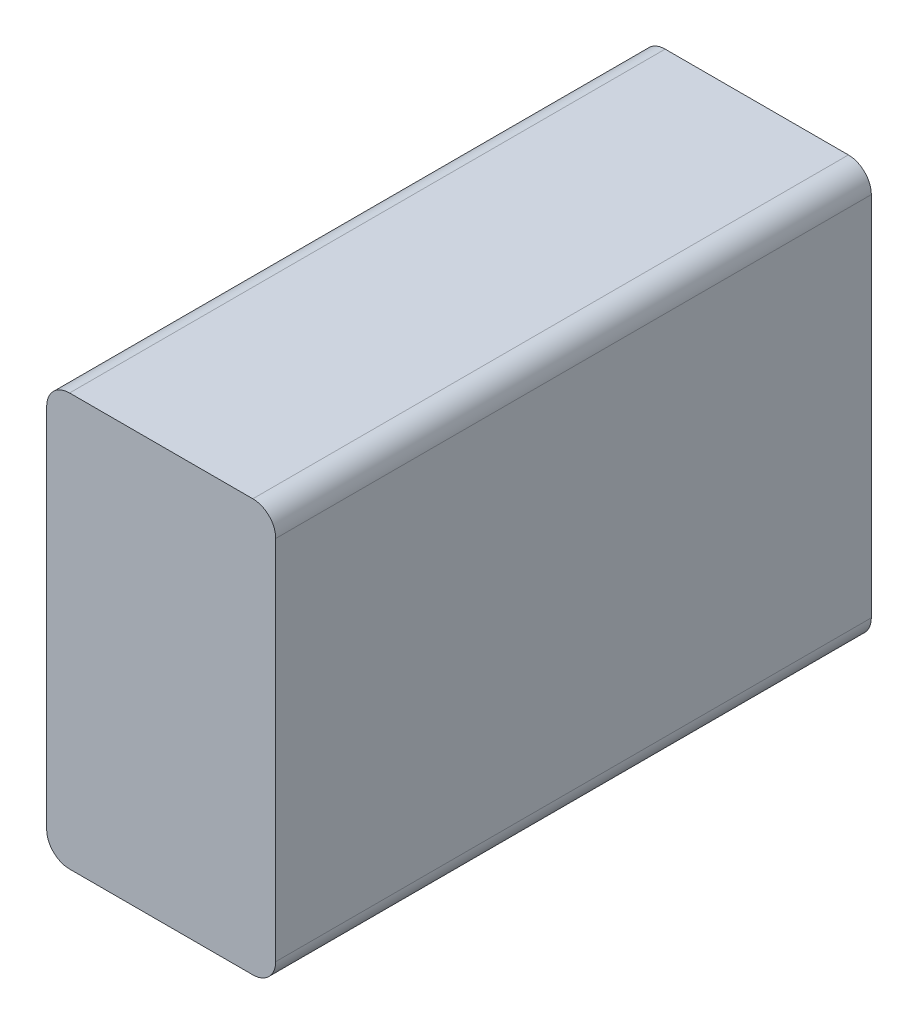
ISO-10303-21;
HEADER;
FILE_DESCRIPTION(('STEP AP214'),'2;1');
FILE_NAME('part.step','',(''),(''),'','','');
FILE_SCHEMA(('AUTOMOTIVE_DESIGN { 1 0 10303 214 1 1 1 1 }'));
ENDSEC;
DATA;
#1=APPLICATION_CONTEXT('core data for automotive mechanical design processes');
#2=APPLICATION_PROTOCOL_DEFINITION('international standard','automotive_design',2000,#1);
#3=PRODUCT_CONTEXT('',#1,'mechanical');
#4=PRODUCT('Part','Part','',(#3));
#5=PRODUCT_RELATED_PRODUCT_CATEGORY('part','',(#4));
#6=PRODUCT_DEFINITION_FORMATION('','',#4);
#7=PRODUCT_DEFINITION_CONTEXT('part definition',#1,'design');
#8=PRODUCT_DEFINITION('design','',#6,#7);
#9=PRODUCT_DEFINITION_SHAPE('','',#8);
#10=(LENGTH_UNIT() NAMED_UNIT(*) SI_UNIT(.MILLI.,.METRE.));
#11=(NAMED_UNIT(*) PLANE_ANGLE_UNIT() SI_UNIT($,.RADIAN.));
#12=(NAMED_UNIT(*) SI_UNIT($,.STERADIAN.) SOLID_ANGLE_UNIT());
#13=UNCERTAINTY_MEASURE_WITH_UNIT(LENGTH_MEASURE(1.E-05),#10,'distance_accuracy_value','');
#14=(GEOMETRIC_REPRESENTATION_CONTEXT(3) GLOBAL_UNCERTAINTY_ASSIGNED_CONTEXT((#13)) GLOBAL_UNIT_ASSIGNED_CONTEXT((#10,
#11,#12)) REPRESENTATION_CONTEXT('',''));
#15=CARTESIAN_POINT('',(0.,0.,0.));
#16=DIRECTION('',(0.,0.,1.));
#17=DIRECTION('',(1.,0.,0.));
#18=AXIS2_PLACEMENT_3D('',#15,#16,#17);
#19=CARTESIAN_POINT('',(-61.1526989816066,9.9853372072383,26.));
#20=DIRECTION('',(0.,0.,-1.));
#21=DIRECTION('',(-1.,0.,0.));
#22=AXIS2_PLACEMENT_3D('',#19,#20,#21);
#23=CYLINDRICAL_SURFACE('',#22,1.);
#24=CARTESIAN_POINT('',(-61.1526989816066,9.9853372072383,0.));
#25=DIRECTION('',(0.,0.,1.));
#26=DIRECTION('',(-1.,0.,0.));
#27=AXIS2_PLACEMENT_3D('',#24,#25,#26);
#28=CIRCLE('',#27,1.);
#29=CARTESIAN_POINT('',(-61.1526989816066,10.9853372072383,0.));
#30=VERTEX_POINT('',#29);
#31=CARTESIAN_POINT('',(-62.1526989816066,9.98533720723832,0.));
#32=VERTEX_POINT('',#31);
#33=EDGE_CURVE('E140',#30,#32,#28,.T.);
#34=ORIENTED_EDGE('',*,*,#33,.T.);
#35=DIRECTION('',(0.,0.,-1.));
#36=VECTOR('',#35,1.);
#37=CARTESIAN_POINT('',(-62.1526989816066,9.98533720723832,26.));
#38=LINE('',#37,#36);
#39=CARTESIAN_POINT('',(-62.1526989816066,9.98533720723832,26.));
#40=VERTEX_POINT('',#39);
#41=EDGE_CURVE('E11',#40,#32,#38,.T.);
#42=ORIENTED_EDGE('',*,*,#41,.F.);
#43=CARTESIAN_POINT('',(-61.1526989816066,9.9853372072383,26.));
#44=DIRECTION('',(0.,0.,1.));
#45=DIRECTION('',(-1.,0.,0.));
#46=AXIS2_PLACEMENT_3D('',#43,#44,#45);
#47=CIRCLE('',#46,1.);
#48=CARTESIAN_POINT('',(-61.1526989816066,10.9853372072383,26.));
#49=VERTEX_POINT('',#48);
#50=EDGE_CURVE('E162',#49,#40,#47,.T.);
#51=ORIENTED_EDGE('',*,*,#50,.F.);
#52=DIRECTION('',(0.,0.,-1.));
#53=VECTOR('',#52,1.);
#54=CARTESIAN_POINT('',(-61.1526989816066,10.9853372072383,26.));
#55=LINE('',#54,#53);
#56=EDGE_CURVE('E136',#49,#30,#55,.T.);
#57=ORIENTED_EDGE('',*,*,#56,.T.);
#58=EDGE_LOOP('',(#34,#42,#51,#57));
#59=FACE_BOUND('',#58,.T.);
#60=ADVANCED_FACE('F39',(#59),#23,.T.);
#61=CARTESIAN_POINT('',(-62.1526989816066,9.98533720723832,26.));
#62=DIRECTION('',(1.,0.,0.));
#63=DIRECTION('',(0.,1.,0.));
#64=AXIS2_PLACEMENT_3D('',#61,#62,#63);
#65=PLANE('',#64);
#66=DIRECTION('',(0.,-1.,0.));
#67=VECTOR('',#66,1.);
#68=CARTESIAN_POINT('',(-62.1526989816066,9.98533720723832,0.));
#69=LINE('',#68,#67);
#70=CARTESIAN_POINT('',(-62.1526989816066,-6.0146627927617,0.));
#71=VERTEX_POINT('',#70);
#72=EDGE_CURVE('E144',#32,#71,#69,.T.);
#73=ORIENTED_EDGE('',*,*,#72,.T.);
#74=DIRECTION('',(0.,0.,-1.));
#75=VECTOR('',#74,1.);
#76=CARTESIAN_POINT('',(-62.1526989816066,-6.0146627927617,26.));
#77=LINE('',#76,#75);
#78=CARTESIAN_POINT('',(-62.1526989816066,-6.0146627927617,26.));
#79=VERTEX_POINT('',#78);
#80=EDGE_CURVE('E48',#79,#71,#77,.T.);
#81=ORIENTED_EDGE('',*,*,#80,.F.);
#82=DIRECTION('',(0.,-1.,0.));
#83=VECTOR('',#82,1.);
#84=CARTESIAN_POINT('',(-62.1526989816066,9.98533720723832,26.));
#85=LINE('',#84,#83);
#86=EDGE_CURVE('E99',#40,#79,#85,.T.);
#87=ORIENTED_EDGE('',*,*,#86,.F.);
#88=ORIENTED_EDGE('',*,*,#41,.T.);
#89=EDGE_LOOP('',(#73,#81,#87,#88));
#90=FACE_BOUND('',#89,.T.);
#91=ADVANCED_FACE('F208',(#90),#65,.F.);
#92=CARTESIAN_POINT('',(-61.1526989816066,-6.01466279276169,26.));
#93=DIRECTION('',(0.,0.,-1.));
#94=DIRECTION('',(-1.,0.,0.));
#95=AXIS2_PLACEMENT_3D('',#92,#93,#94);
#96=CYLINDRICAL_SURFACE('',#95,0.999999999999999);
#97=CARTESIAN_POINT('',(-61.1526989816066,-6.01466279276169,0.));
#98=DIRECTION('',(0.,0.,1.));
#99=DIRECTION('',(1.,0.,0.));
#100=AXIS2_PLACEMENT_3D('',#97,#98,#99);
#101=CIRCLE('',#100,0.999999999999999);
#102=CARTESIAN_POINT('',(-61.1526989816066,-7.01466279276169,0.));
#103=VERTEX_POINT('',#102);
#104=EDGE_CURVE('E147',#71,#103,#101,.T.);
#105=ORIENTED_EDGE('',*,*,#104,.T.);
#106=DIRECTION('',(0.,0.,-1.));
#107=VECTOR('',#106,1.);
#108=CARTESIAN_POINT('',(-61.1526989816066,-7.01466279276169,26.));
#109=LINE('',#108,#107);
#110=CARTESIAN_POINT('',(-61.1526989816066,-7.01466279276169,26.));
#111=VERTEX_POINT('',#110);
#112=EDGE_CURVE('E173',#111,#103,#109,.T.);
#113=ORIENTED_EDGE('',*,*,#112,.F.);
#114=CARTESIAN_POINT('',(-61.1526989816066,-6.01466279276169,26.));
#115=DIRECTION('',(0.,0.,1.));
#116=DIRECTION('',(1.,0.,0.));
#117=AXIS2_PLACEMENT_3D('',#114,#115,#116);
#118=CIRCLE('',#117,0.999999999999999);
#119=EDGE_CURVE('E183',#79,#111,#118,.T.);
#120=ORIENTED_EDGE('',*,*,#119,.F.);
#121=ORIENTED_EDGE('',*,*,#80,.T.);
#122=EDGE_LOOP('',(#105,#113,#120,#121));
#123=FACE_BOUND('',#122,.T.);
#124=ADVANCED_FACE('F181',(#123),#96,.T.);
#125=CARTESIAN_POINT('',(-53.1526989816066,-7.01466279276169,26.));
#126=DIRECTION('',(0.,1.,0.));
#127=DIRECTION('',(0.,0.,1.));
#128=AXIS2_PLACEMENT_3D('',#125,#126,#127);
#129=PLANE('',#128);
#130=DIRECTION('',(1.,0.,0.));
#131=VECTOR('',#130,1.);
#132=CARTESIAN_POINT('',(-53.1526989816066,-7.01466279276169,0.));
#133=LINE('',#132,#131);
#134=CARTESIAN_POINT('',(-53.1526989816066,-7.01466279276169,0.));
#135=VERTEX_POINT('',#134);
#136=EDGE_CURVE('E150',#103,#135,#133,.T.);
#137=ORIENTED_EDGE('',*,*,#136,.T.);
#138=DIRECTION('',(0.,0.,-1.));
#139=VECTOR('',#138,1.);
#140=CARTESIAN_POINT('',(-53.1526989816066,-7.01466279276169,26.));
#141=LINE('',#140,#139);
#142=CARTESIAN_POINT('',(-53.1526989816066,-7.01466279276169,26.));
#143=VERTEX_POINT('',#142);
#144=EDGE_CURVE('E169',#143,#135,#141,.T.);
#145=ORIENTED_EDGE('',*,*,#144,.F.);
#146=DIRECTION('',(1.,0.,0.));
#147=VECTOR('',#146,1.);
#148=CARTESIAN_POINT('',(-53.1526989816066,-7.01466279276169,26.));
#149=LINE('',#148,#147);
#150=EDGE_CURVE('E196',#111,#143,#149,.T.);
#151=ORIENTED_EDGE('',*,*,#150,.F.);
#152=ORIENTED_EDGE('',*,*,#112,.T.);
#153=EDGE_LOOP('',(#137,#145,#151,#152));
#154=FACE_BOUND('',#153,.T.);
#155=ADVANCED_FACE('F191',(#154),#129,.F.);
#156=CARTESIAN_POINT('',(-53.1526989816066,-6.01466279276169,26.));
#157=DIRECTION('',(0.,0.,-1.));
#158=DIRECTION('',(-1.,0.,0.));
#159=AXIS2_PLACEMENT_3D('',#156,#157,#158);
#160=CYLINDRICAL_SURFACE('',#159,1.);
#161=CARTESIAN_POINT('',(-53.1526989816066,-6.01466279276169,0.));
#162=DIRECTION('',(0.,0.,1.));
#163=DIRECTION('',(-1.,0.,0.));
#164=AXIS2_PLACEMENT_3D('',#161,#162,#163);
#165=CIRCLE('',#164,1.);
#166=CARTESIAN_POINT('',(-52.1526989816066,-6.0146627927617,0.));
#167=VERTEX_POINT('',#166);
#168=EDGE_CURVE('E153',#135,#167,#165,.T.);
#169=ORIENTED_EDGE('',*,*,#168,.T.);
#170=DIRECTION('',(0.,0.,-1.));
#171=VECTOR('',#170,1.);
#172=CARTESIAN_POINT('',(-52.1526989816066,-6.0146627927617,26.));
#173=LINE('',#172,#171);
#174=CARTESIAN_POINT('',(-52.1526989816066,-6.0146627927617,26.));
#175=VERTEX_POINT('',#174);
#176=EDGE_CURVE('E129',#175,#167,#173,.T.);
#177=ORIENTED_EDGE('',*,*,#176,.F.);
#178=CARTESIAN_POINT('',(-53.1526989816066,-6.01466279276169,26.));
#179=DIRECTION('',(0.,0.,1.));
#180=DIRECTION('',(-1.,0.,0.));
#181=AXIS2_PLACEMENT_3D('',#178,#179,#180);
#182=CIRCLE('',#181,1.);
#183=EDGE_CURVE('E118',#143,#175,#182,.T.);
#184=ORIENTED_EDGE('',*,*,#183,.F.);
#185=ORIENTED_EDGE('',*,*,#144,.T.);
#186=EDGE_LOOP('',(#169,#177,#184,#185));
#187=FACE_BOUND('',#186,.T.);
#188=ADVANCED_FACE('F194',(#187),#160,.T.);
#189=CARTESIAN_POINT('',(-52.1526989816066,9.98533720723832,26.));
#190=DIRECTION('',(-1.,0.,0.));
#191=DIRECTION('',(0.,0.,1.));
#192=AXIS2_PLACEMENT_3D('',#189,#190,#191);
#193=PLANE('',#192);
#194=DIRECTION('',(0.,1.,0.));
#195=VECTOR('',#194,1.);
#196=CARTESIAN_POINT('',(-52.1526989816066,9.98533720723832,0.));
#197=LINE('',#196,#195);
#198=CARTESIAN_POINT('',(-52.1526989816066,9.98533720723832,0.));
#199=VERTEX_POINT('',#198);
#200=EDGE_CURVE('E127',#167,#199,#197,.T.);
#201=ORIENTED_EDGE('',*,*,#200,.T.);
#202=DIRECTION('',(0.,0.,-1.));
#203=VECTOR('',#202,1.);
#204=CARTESIAN_POINT('',(-52.1526989816066,9.98533720723832,26.));
#205=LINE('',#204,#203);
#206=CARTESIAN_POINT('',(-52.1526989816066,9.98533720723832,26.));
#207=VERTEX_POINT('',#206);
#208=EDGE_CURVE('E124',#207,#199,#205,.T.);
#209=ORIENTED_EDGE('',*,*,#208,.F.);
#210=DIRECTION('',(0.,1.,0.));
#211=VECTOR('',#210,1.);
#212=CARTESIAN_POINT('',(-52.1526989816066,9.98533720723832,26.));
#213=LINE('',#212,#211);
#214=EDGE_CURVE('E112',#175,#207,#213,.T.);
#215=ORIENTED_EDGE('',*,*,#214,.F.);
#216=ORIENTED_EDGE('',*,*,#176,.T.);
#217=EDGE_LOOP('',(#201,#209,#215,#216));
#218=FACE_BOUND('',#217,.T.);
#219=ADVANCED_FACE('F125',(#218),#193,.F.);
#220=CARTESIAN_POINT('',(-53.1526989816066,9.9853372072383,26.));
#221=DIRECTION('',(0.,0.,-1.));
#222=DIRECTION('',(-1.,0.,0.));
#223=AXIS2_PLACEMENT_3D('',#220,#221,#222);
#224=CYLINDRICAL_SURFACE('',#223,1.);
#225=CARTESIAN_POINT('',(-53.1526989816066,9.9853372072383,0.));
#226=DIRECTION('',(0.,0.,1.));
#227=DIRECTION('',(1.,0.,0.));
#228=AXIS2_PLACEMENT_3D('',#225,#226,#227);
#229=CIRCLE('',#228,1.);
#230=CARTESIAN_POINT('',(-53.1526989816066,10.9853372072383,0.));
#231=VERTEX_POINT('',#230);
#232=EDGE_CURVE('E85',#199,#231,#229,.T.);
#233=ORIENTED_EDGE('',*,*,#232,.T.);
#234=DIRECTION('',(0.,0.,-1.));
#235=VECTOR('',#234,1.);
#236=CARTESIAN_POINT('',(-53.1526989816066,10.9853372072383,26.));
#237=LINE('',#236,#235);
#238=CARTESIAN_POINT('',(-53.1526989816066,10.9853372072383,26.));
#239=VERTEX_POINT('',#238);
#240=EDGE_CURVE('E130',#239,#231,#237,.T.);
#241=ORIENTED_EDGE('',*,*,#240,.F.);
#242=CARTESIAN_POINT('',(-53.1526989816066,9.9853372072383,26.));
#243=DIRECTION('',(0.,0.,1.));
#244=DIRECTION('',(1.,0.,0.));
#245=AXIS2_PLACEMENT_3D('',#242,#243,#244);
#246=CIRCLE('',#245,1.);
#247=EDGE_CURVE('E116',#207,#239,#246,.T.);
#248=ORIENTED_EDGE('',*,*,#247,.F.);
#249=ORIENTED_EDGE('',*,*,#208,.T.);
#250=EDGE_LOOP('',(#233,#241,#248,#249));
#251=FACE_BOUND('',#250,.T.);
#252=ADVANCED_FACE('F132',(#251),#224,.T.);
#253=CARTESIAN_POINT('',(-53.1526989816066,10.9853372072383,26.));
#254=DIRECTION('',(0.,-1.,0.));
#255=DIRECTION('',(1.,0.,0.));
#256=AXIS2_PLACEMENT_3D('',#253,#254,#255);
#257=PLANE('',#256);
#258=DIRECTION('',(-1.,0.,0.));
#259=VECTOR('',#258,1.);
#260=CARTESIAN_POINT('',(-53.1526989816066,10.9853372072383,0.));
#261=LINE('',#260,#259);
#262=EDGE_CURVE('E91',#231,#30,#261,.T.);
#263=ORIENTED_EDGE('',*,*,#262,.T.);
#264=ORIENTED_EDGE('',*,*,#56,.F.);
#265=DIRECTION('',(-1.,0.,0.));
#266=VECTOR('',#265,1.);
#267=CARTESIAN_POINT('',(-53.1526989816066,10.9853372072383,26.));
#268=LINE('',#267,#266);
#269=EDGE_CURVE('E56',#239,#49,#268,.T.);
#270=ORIENTED_EDGE('',*,*,#269,.F.);
#271=ORIENTED_EDGE('',*,*,#240,.T.);
#272=EDGE_LOOP('',(#263,#264,#270,#271));
#273=FACE_BOUND('',#272,.T.);
#274=ADVANCED_FACE('F224',(#273),#257,.F.);
#275=CARTESIAN_POINT('',(-61.1526989816066,9.9853372072383,26.));
#276=DIRECTION('',(0.,0.,-1.));
#277=DIRECTION('',(-1.,0.,0.));
#278=AXIS2_PLACEMENT_3D('',#275,#276,#277);
#279=PLANE('',#278);
#280=ORIENTED_EDGE('',*,*,#50,.T.);
#281=ORIENTED_EDGE('',*,*,#86,.T.);
#282=ORIENTED_EDGE('',*,*,#119,.T.);
#283=ORIENTED_EDGE('',*,*,#150,.T.);
#284=ORIENTED_EDGE('',*,*,#183,.T.);
#285=ORIENTED_EDGE('',*,*,#214,.T.);
#286=ORIENTED_EDGE('',*,*,#247,.T.);
#287=ORIENTED_EDGE('',*,*,#269,.T.);
#288=EDGE_LOOP('',(#280,#281,#282,#283,#284,#285,#286,#287));
#289=FACE_BOUND('',#288,.T.);
#290=ADVANCED_FACE('F114',(#289),#279,.F.);
#291=CARTESIAN_POINT('',(-61.1526989816066,9.9853372072383,0.));
#292=DIRECTION('',(0.,0.,-1.));
#293=DIRECTION('',(-1.,0.,0.));
#294=AXIS2_PLACEMENT_3D('',#291,#292,#293);
#295=PLANE('',#294);
#296=ORIENTED_EDGE('',*,*,#33,.F.);
#297=ORIENTED_EDGE('',*,*,#262,.F.);
#298=ORIENTED_EDGE('',*,*,#232,.F.);
#299=ORIENTED_EDGE('',*,*,#200,.F.);
#300=ORIENTED_EDGE('',*,*,#168,.F.);
#301=ORIENTED_EDGE('',*,*,#136,.F.);
#302=ORIENTED_EDGE('',*,*,#104,.F.);
#303=ORIENTED_EDGE('',*,*,#72,.F.);
#304=EDGE_LOOP('',(#296,#297,#298,#299,#300,#301,#302,#303));
#305=FACE_BOUND('',#304,.T.);
#306=ADVANCED_FACE('F187',(#305),#295,.T.);
#307=CLOSED_SHELL('',(#60,#91,#124,#155,#188,#219,#252,#274,#290,#306));
#308=MANIFOLD_SOLID_BREP('B2',#307);
#309=ADVANCED_BREP_SHAPE_REPRESENTATION('',(#18,#308),#14);
#310=SHAPE_DEFINITION_REPRESENTATION(#9,#309);
ENDSEC;
END-ISO-10303-21;
